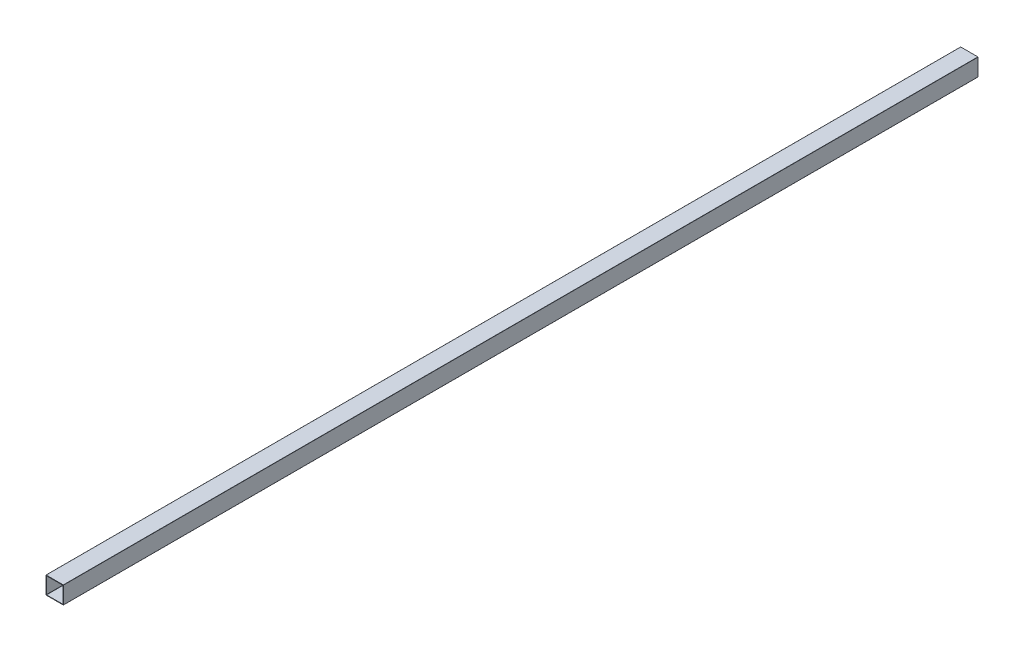
ISO-10303-21;
HEADER;
FILE_DESCRIPTION(('STEP AP214'),'2;1');
FILE_NAME('part.step','',(''),(''),'','','');
FILE_SCHEMA(('AUTOMOTIVE_DESIGN { 1 0 10303 214 1 1 1 1 }'));
ENDSEC;
DATA;
#1=APPLICATION_CONTEXT('core data for automotive mechanical design processes');
#2=APPLICATION_PROTOCOL_DEFINITION('international standard','automotive_design',2000,#1);
#3=PRODUCT_CONTEXT('',#1,'mechanical');
#4=PRODUCT('Part','Part','',(#3));
#5=PRODUCT_RELATED_PRODUCT_CATEGORY('part','',(#4));
#6=PRODUCT_DEFINITION_FORMATION('','',#4);
#7=PRODUCT_DEFINITION_CONTEXT('part definition',#1,'design');
#8=PRODUCT_DEFINITION('design','',#6,#7);
#9=PRODUCT_DEFINITION_SHAPE('','',#8);
#10=(LENGTH_UNIT() NAMED_UNIT(*) SI_UNIT(.MILLI.,.METRE.));
#11=(NAMED_UNIT(*) PLANE_ANGLE_UNIT() SI_UNIT($,.RADIAN.));
#12=(NAMED_UNIT(*) SI_UNIT($,.STERADIAN.) SOLID_ANGLE_UNIT());
#13=UNCERTAINTY_MEASURE_WITH_UNIT(LENGTH_MEASURE(1.E-05),#10,'distance_accuracy_value','');
#14=(GEOMETRIC_REPRESENTATION_CONTEXT(3) GLOBAL_UNCERTAINTY_ASSIGNED_CONTEXT((#13)) GLOBAL_UNIT_ASSIGNED_CONTEXT((#10,
#11,#12)) REPRESENTATION_CONTEXT('',''));
#15=CARTESIAN_POINT('',(0.,0.,0.));
#16=DIRECTION('',(0.,0.,1.));
#17=DIRECTION('',(1.,0.,0.));
#18=AXIS2_PLACEMENT_3D('',#15,#16,#17);
#19=CARTESIAN_POINT('',(57.15,-57.15,-6000.));
#20=DIRECTION('',(1.,0.,0.));
#21=DIRECTION('',(0.,0.,-1.));
#22=AXIS2_PLACEMENT_3D('',#19,#20,#21);
#23=PLANE('',#22);
#24=DIRECTION('',(0.,1.,0.));
#25=VECTOR('',#24,1.);
#26=CARTESIAN_POINT('',(57.15,-57.15,0.));
#27=LINE('',#26,#25);
#28=CARTESIAN_POINT('',(57.15,-56.15,0.));
#29=VERTEX_POINT('',#28);
#30=CARTESIAN_POINT('',(57.15,56.15,0.));
#31=VERTEX_POINT('',#30);
#32=EDGE_CURVE('E197',#29,#31,#27,.T.);
#33=ORIENTED_EDGE('',*,*,#32,.F.);
#34=DIRECTION('',(0.,0.,1.));
#35=VECTOR('',#34,1.);
#36=CARTESIAN_POINT('',(57.15,-56.15,-6000.));
#37=LINE('',#36,#35);
#38=CARTESIAN_POINT('',(57.15,-56.15,-6000.));
#39=VERTEX_POINT('',#38);
#40=EDGE_CURVE('E158',#29,#39,#37,.F.);
#41=ORIENTED_EDGE('',*,*,#40,.T.);
#42=DIRECTION('',(0.,1.,0.));
#43=VECTOR('',#42,1.);
#44=CARTESIAN_POINT('',(57.15,-57.15,-6000.));
#45=LINE('',#44,#43);
#46=CARTESIAN_POINT('',(57.15,56.15,-6000.));
#47=VERTEX_POINT('',#46);
#48=EDGE_CURVE('E185',#39,#47,#45,.T.);
#49=ORIENTED_EDGE('',*,*,#48,.T.);
#50=DIRECTION('',(0.,0.,1.));
#51=VECTOR('',#50,1.);
#52=CARTESIAN_POINT('',(57.15,56.15,-6000.));
#53=LINE('',#52,#51);
#54=EDGE_CURVE('E251',#47,#31,#53,.T.);
#55=ORIENTED_EDGE('',*,*,#54,.T.);
#56=EDGE_LOOP('',(#33,#41,#49,#55));
#57=FACE_BOUND('',#56,.T.);
#58=ADVANCED_FACE('F33',(#57),#23,.T.);
#59=CARTESIAN_POINT('',(-57.15,-57.15,-6000.));
#60=DIRECTION('',(0.,-1.,0.));
#61=DIRECTION('',(0.,0.,-1.));
#62=AXIS2_PLACEMENT_3D('',#59,#60,#61);
#63=PLANE('',#62);
#64=DIRECTION('',(1.,0.,0.));
#65=VECTOR('',#64,1.);
#66=CARTESIAN_POINT('',(-57.15,-57.15,0.));
#67=LINE('',#66,#65);
#68=CARTESIAN_POINT('',(-56.15,-57.15,0.));
#69=VERTEX_POINT('',#68);
#70=CARTESIAN_POINT('',(56.15,-57.15,0.));
#71=VERTEX_POINT('',#70);
#72=EDGE_CURVE('E189',#69,#71,#67,.T.);
#73=ORIENTED_EDGE('',*,*,#72,.F.);
#74=DIRECTION('',(0.,0.,1.));
#75=VECTOR('',#74,1.);
#76=CARTESIAN_POINT('',(-56.15,-57.15,-6000.));
#77=LINE('',#76,#75);
#78=CARTESIAN_POINT('',(-56.15,-57.15,-6000.));
#79=VERTEX_POINT('',#78);
#80=EDGE_CURVE('E238',#69,#79,#77,.F.);
#81=ORIENTED_EDGE('',*,*,#80,.T.);
#82=DIRECTION('',(1.,0.,0.));
#83=VECTOR('',#82,1.);
#84=CARTESIAN_POINT('',(-57.15,-57.15,-6000.));
#85=LINE('',#84,#83);
#86=CARTESIAN_POINT('',(56.15,-57.15,-6000.));
#87=VERTEX_POINT('',#86);
#88=EDGE_CURVE('E194',#79,#87,#85,.T.);
#89=ORIENTED_EDGE('',*,*,#88,.T.);
#90=DIRECTION('',(0.,0.,1.));
#91=VECTOR('',#90,1.);
#92=CARTESIAN_POINT('',(56.15,-57.15,-6000.));
#93=LINE('',#92,#91);
#94=EDGE_CURVE('E235',#87,#71,#93,.T.);
#95=ORIENTED_EDGE('',*,*,#94,.T.);
#96=EDGE_LOOP('',(#73,#81,#89,#95));
#97=FACE_BOUND('',#96,.T.);
#98=ADVANCED_FACE('F305',(#97),#63,.T.);
#99=CARTESIAN_POINT('',(-57.15,-57.15,-6000.));
#100=DIRECTION('',(-1.,0.,0.));
#101=DIRECTION('',(0.,0.,1.));
#102=AXIS2_PLACEMENT_3D('',#99,#100,#101);
#103=PLANE('',#102);
#104=DIRECTION('',(0.,-1.,0.));
#105=VECTOR('',#104,1.);
#106=CARTESIAN_POINT('',(-57.15,-57.15,-6000.));
#107=LINE('',#106,#105);
#108=CARTESIAN_POINT('',(-57.15,56.15,-6000.));
#109=VERTEX_POINT('',#108);
#110=CARTESIAN_POINT('',(-57.15,-56.15,-6000.));
#111=VERTEX_POINT('',#110);
#112=EDGE_CURVE('E191',#109,#111,#107,.T.);
#113=ORIENTED_EDGE('',*,*,#112,.T.);
#114=DIRECTION('',(0.,0.,1.));
#115=VECTOR('',#114,1.);
#116=CARTESIAN_POINT('',(-57.15,-56.15,-6000.));
#117=LINE('',#116,#115);
#118=CARTESIAN_POINT('',(-57.15,-56.15,0.));
#119=VERTEX_POINT('',#118);
#120=EDGE_CURVE('E224',#111,#119,#117,.T.);
#121=ORIENTED_EDGE('',*,*,#120,.T.);
#122=DIRECTION('',(0.,-1.,0.));
#123=VECTOR('',#122,1.);
#124=CARTESIAN_POINT('',(-57.15,-57.15,0.));
#125=LINE('',#124,#123);
#126=CARTESIAN_POINT('',(-57.15,56.15,0.));
#127=VERTEX_POINT('',#126);
#128=EDGE_CURVE('E203',#127,#119,#125,.T.);
#129=ORIENTED_EDGE('',*,*,#128,.F.);
#130=DIRECTION('',(0.,0.,1.));
#131=VECTOR('',#130,1.);
#132=CARTESIAN_POINT('',(-57.15,56.15,-6000.));
#133=LINE('',#132,#131);
#134=EDGE_CURVE('E222',#127,#109,#133,.F.);
#135=ORIENTED_EDGE('',*,*,#134,.T.);
#136=EDGE_LOOP('',(#113,#121,#129,#135));
#137=FACE_BOUND('',#136,.T.);
#138=ADVANCED_FACE('F311',(#137),#103,.T.);
#139=CARTESIAN_POINT('',(-57.15,57.15,-6000.));
#140=DIRECTION('',(0.,1.,0.));
#141=DIRECTION('',(0.,0.,1.));
#142=AXIS2_PLACEMENT_3D('',#139,#140,#141);
#143=PLANE('',#142);
#144=DIRECTION('',(-1.,0.,0.));
#145=VECTOR('',#144,1.);
#146=CARTESIAN_POINT('',(-57.15,57.15,-6000.));
#147=LINE('',#146,#145);
#148=CARTESIAN_POINT('',(56.15,57.15,-6000.));
#149=VERTEX_POINT('',#148);
#150=CARTESIAN_POINT('',(-56.15,57.15,-6000.));
#151=VERTEX_POINT('',#150);
#152=EDGE_CURVE('E188',#149,#151,#147,.T.);
#153=ORIENTED_EDGE('',*,*,#152,.T.);
#154=DIRECTION('',(0.,0.,1.));
#155=VECTOR('',#154,1.);
#156=CARTESIAN_POINT('',(-56.15,57.15,-6000.));
#157=LINE('',#156,#155);
#158=CARTESIAN_POINT('',(-56.15,57.15,0.));
#159=VERTEX_POINT('',#158);
#160=EDGE_CURVE('E248',#151,#159,#157,.T.);
#161=ORIENTED_EDGE('',*,*,#160,.T.);
#162=DIRECTION('',(-1.,0.,0.));
#163=VECTOR('',#162,1.);
#164=CARTESIAN_POINT('',(-57.15,57.15,0.));
#165=LINE('',#164,#163);
#166=CARTESIAN_POINT('',(56.15,57.15,0.));
#167=VERTEX_POINT('',#166);
#168=EDGE_CURVE('E200',#167,#159,#165,.T.);
#169=ORIENTED_EDGE('',*,*,#168,.F.);
#170=DIRECTION('',(0.,0.,1.));
#171=VECTOR('',#170,1.);
#172=CARTESIAN_POINT('',(56.15,57.15,-6000.));
#173=LINE('',#172,#171);
#174=EDGE_CURVE('E55',#167,#149,#173,.F.);
#175=ORIENTED_EDGE('',*,*,#174,.T.);
#176=EDGE_LOOP('',(#153,#161,#169,#175));
#177=FACE_BOUND('',#176,.T.);
#178=ADVANCED_FACE('F316',(#177),#143,.T.);
#179=CARTESIAN_POINT('',(0.,0.,-6000.));
#180=DIRECTION('',(0.,0.,-1.));
#181=DIRECTION('',(-1.,0.,0.));
#182=AXIS2_PLACEMENT_3D('',#179,#180,#181);
#183=PLANE('',#182);
#184=DIRECTION('',(0.,-1.,0.));
#185=VECTOR('',#184,1.);
#186=CARTESIAN_POINT('',(-54.11,-54.11,-6000.));
#187=LINE('',#186,#185);
#188=CARTESIAN_POINT('',(-54.11,53.11,-6000.));
#189=VERTEX_POINT('',#188);
#190=CARTESIAN_POINT('',(-54.11,-53.11,-6000.));
#191=VERTEX_POINT('',#190);
#192=EDGE_CURVE('E167',#189,#191,#187,.T.);
#193=ORIENTED_EDGE('',*,*,#192,.T.);
#194=CARTESIAN_POINT('',(-53.11,-53.11,-6000.));
#195=DIRECTION('',(0.,0.,-1.));
#196=DIRECTION('',(-1.,0.,0.));
#197=AXIS2_PLACEMENT_3D('',#194,#195,#196);
#198=CIRCLE('',#197,1.);
#199=CARTESIAN_POINT('',(-53.11,-54.11,-6000.));
#200=VERTEX_POINT('',#199);
#201=EDGE_CURVE('E11',#191,#200,#198,.F.);
#202=ORIENTED_EDGE('',*,*,#201,.T.);
#203=DIRECTION('',(1.,0.,0.));
#204=VECTOR('',#203,1.);
#205=CARTESIAN_POINT('',(-54.11,-54.11,-6000.));
#206=LINE('',#205,#204);
#207=CARTESIAN_POINT('',(53.11,-54.11,-6000.));
#208=VERTEX_POINT('',#207);
#209=EDGE_CURVE('E175',#200,#208,#206,.T.);
#210=ORIENTED_EDGE('',*,*,#209,.T.);
#211=CARTESIAN_POINT('',(53.11,-53.11,-6000.));
#212=DIRECTION('',(0.,0.,-1.));
#213=DIRECTION('',(-1.,0.,0.));
#214=AXIS2_PLACEMENT_3D('',#211,#212,#213);
#215=CIRCLE('',#214,1.);
#216=CARTESIAN_POINT('',(54.11,-53.11,-6000.));
#217=VERTEX_POINT('',#216);
#218=EDGE_CURVE('E262',#208,#217,#215,.F.);
#219=ORIENTED_EDGE('',*,*,#218,.T.);
#220=DIRECTION('',(0.,1.,0.));
#221=VECTOR('',#220,1.);
#222=CARTESIAN_POINT('',(54.11,-54.11,-6000.));
#223=LINE('',#222,#221);
#224=CARTESIAN_POINT('',(54.11,53.11,-6000.));
#225=VERTEX_POINT('',#224);
#226=EDGE_CURVE('E179',#217,#225,#223,.T.);
#227=ORIENTED_EDGE('',*,*,#226,.T.);
#228=CARTESIAN_POINT('',(53.11,53.11,-6000.));
#229=DIRECTION('',(0.,0.,-1.));
#230=DIRECTION('',(-1.,0.,0.));
#231=AXIS2_PLACEMENT_3D('',#228,#229,#230);
#232=CIRCLE('',#231,1.);
#233=CARTESIAN_POINT('',(53.11,54.11,-6000.));
#234=VERTEX_POINT('',#233);
#235=EDGE_CURVE('E258',#225,#234,#232,.F.);
#236=ORIENTED_EDGE('',*,*,#235,.T.);
#237=DIRECTION('',(-1.,0.,0.));
#238=VECTOR('',#237,1.);
#239=CARTESIAN_POINT('',(-54.11,54.11,-6000.));
#240=LINE('',#239,#238);
#241=CARTESIAN_POINT('',(-53.11,54.11,-6000.));
#242=VERTEX_POINT('',#241);
#243=EDGE_CURVE('E277',#234,#242,#240,.T.);
#244=ORIENTED_EDGE('',*,*,#243,.T.);
#245=CARTESIAN_POINT('',(-53.11,53.11,-6000.));
#246=DIRECTION('',(0.,0.,-1.));
#247=DIRECTION('',(-1.,0.,0.));
#248=AXIS2_PLACEMENT_3D('',#245,#246,#247);
#249=CIRCLE('',#248,1.);
#250=EDGE_CURVE('E157',#242,#189,#249,.F.);
#251=ORIENTED_EDGE('',*,*,#250,.T.);
#252=EDGE_LOOP('',(#193,#202,#210,#219,#227,#236,#244,#251));
#253=FACE_BOUND('',#252,.T.);
#254=ORIENTED_EDGE('',*,*,#88,.F.);
#255=CARTESIAN_POINT('',(-56.15,-56.15,-6000.));
#256=DIRECTION('',(0.,0.,-1.));
#257=DIRECTION('',(-1.,0.,0.));
#258=AXIS2_PLACEMENT_3D('',#255,#256,#257);
#259=CIRCLE('',#258,1.);
#260=EDGE_CURVE('E245',#79,#111,#259,.T.);
#261=ORIENTED_EDGE('',*,*,#260,.T.);
#262=ORIENTED_EDGE('',*,*,#112,.F.);
#263=CARTESIAN_POINT('',(-56.15,56.15,-6000.));
#264=DIRECTION('',(0.,0.,-1.));
#265=DIRECTION('',(-1.,0.,0.));
#266=AXIS2_PLACEMENT_3D('',#263,#264,#265);
#267=CIRCLE('',#266,1.);
#268=EDGE_CURVE('E48',#109,#151,#267,.T.);
#269=ORIENTED_EDGE('',*,*,#268,.T.);
#270=ORIENTED_EDGE('',*,*,#152,.F.);
#271=CARTESIAN_POINT('',(56.15,56.15,-6000.));
#272=DIRECTION('',(0.,0.,-1.));
#273=DIRECTION('',(-1.,0.,0.));
#274=AXIS2_PLACEMENT_3D('',#271,#272,#273);
#275=CIRCLE('',#274,1.);
#276=EDGE_CURVE('E240',#149,#47,#275,.T.);
#277=ORIENTED_EDGE('',*,*,#276,.T.);
#278=ORIENTED_EDGE('',*,*,#48,.F.);
#279=CARTESIAN_POINT('',(56.15,-56.15,-6000.));
#280=DIRECTION('',(0.,0.,-1.));
#281=DIRECTION('',(-1.,0.,0.));
#282=AXIS2_PLACEMENT_3D('',#279,#280,#281);
#283=CIRCLE('',#282,1.);
#284=EDGE_CURVE('E242',#39,#87,#283,.T.);
#285=ORIENTED_EDGE('',*,*,#284,.T.);
#286=EDGE_LOOP('',(#254,#261,#262,#269,#270,#277,#278,#285));
#287=FACE_BOUND('',#286,.T.);
#288=ADVANCED_FACE('F267',(#253,#287),#183,.T.);
#289=CARTESIAN_POINT('',(0.,0.,0.));
#290=DIRECTION('',(0.,0.,-1.));
#291=DIRECTION('',(-1.,0.,0.));
#292=AXIS2_PLACEMENT_3D('',#289,#290,#291);
#293=PLANE('',#292);
#294=DIRECTION('',(0.,1.,0.));
#295=VECTOR('',#294,1.);
#296=CARTESIAN_POINT('',(54.11,-54.11,0.));
#297=LINE('',#296,#295);
#298=CARTESIAN_POINT('',(54.11,-53.11,0.));
#299=VERTEX_POINT('',#298);
#300=CARTESIAN_POINT('',(54.11,53.11,0.));
#301=VERTEX_POINT('',#300);
#302=EDGE_CURVE('E181',#299,#301,#297,.T.);
#303=ORIENTED_EDGE('',*,*,#302,.F.);
#304=CARTESIAN_POINT('',(53.11,-53.11,0.));
#305=DIRECTION('',(0.,0.,-1.));
#306=DIRECTION('',(-1.,0.,0.));
#307=AXIS2_PLACEMENT_3D('',#304,#305,#306);
#308=CIRCLE('',#307,1.);
#309=CARTESIAN_POINT('',(53.11,-54.11,0.));
#310=VERTEX_POINT('',#309);
#311=EDGE_CURVE('E260',#299,#310,#308,.T.);
#312=ORIENTED_EDGE('',*,*,#311,.T.);
#313=DIRECTION('',(1.,0.,0.));
#314=VECTOR('',#313,1.);
#315=CARTESIAN_POINT('',(-54.11,-54.11,0.));
#316=LINE('',#315,#314);
#317=CARTESIAN_POINT('',(-53.11,-54.11,0.));
#318=VERTEX_POINT('',#317);
#319=EDGE_CURVE('E281',#318,#310,#316,.T.);
#320=ORIENTED_EDGE('',*,*,#319,.F.);
#321=CARTESIAN_POINT('',(-53.11,-53.11,0.));
#322=DIRECTION('',(0.,0.,-1.));
#323=DIRECTION('',(-1.,0.,0.));
#324=AXIS2_PLACEMENT_3D('',#321,#322,#323);
#325=CIRCLE('',#324,1.);
#326=CARTESIAN_POINT('',(-54.11,-53.11,0.));
#327=VERTEX_POINT('',#326);
#328=EDGE_CURVE('E41',#318,#327,#325,.T.);
#329=ORIENTED_EDGE('',*,*,#328,.T.);
#330=DIRECTION('',(0.,-1.,0.));
#331=VECTOR('',#330,1.);
#332=CARTESIAN_POINT('',(-54.11,-54.11,0.));
#333=LINE('',#332,#331);
#334=CARTESIAN_POINT('',(-54.11,53.11,0.));
#335=VERTEX_POINT('',#334);
#336=EDGE_CURVE('E164',#335,#327,#333,.T.);
#337=ORIENTED_EDGE('',*,*,#336,.F.);
#338=CARTESIAN_POINT('',(-53.11,53.11,0.));
#339=DIRECTION('',(0.,0.,-1.));
#340=DIRECTION('',(-1.,0.,0.));
#341=AXIS2_PLACEMENT_3D('',#338,#339,#340);
#342=CIRCLE('',#341,1.);
#343=CARTESIAN_POINT('',(-53.11,54.11,0.));
#344=VERTEX_POINT('',#343);
#345=EDGE_CURVE('E147',#335,#344,#342,.T.);
#346=ORIENTED_EDGE('',*,*,#345,.T.);
#347=DIRECTION('',(-1.,0.,0.));
#348=VECTOR('',#347,1.);
#349=CARTESIAN_POINT('',(-54.11,54.11,0.));
#350=LINE('',#349,#348);
#351=CARTESIAN_POINT('',(53.11,54.11,0.));
#352=VERTEX_POINT('',#351);
#353=EDGE_CURVE('E176',#352,#344,#350,.T.);
#354=ORIENTED_EDGE('',*,*,#353,.F.);
#355=CARTESIAN_POINT('',(53.11,53.11,0.));
#356=DIRECTION('',(0.,0.,-1.));
#357=DIRECTION('',(-1.,0.,0.));
#358=AXIS2_PLACEMENT_3D('',#355,#356,#357);
#359=CIRCLE('',#358,1.);
#360=EDGE_CURVE('E256',#352,#301,#359,.T.);
#361=ORIENTED_EDGE('',*,*,#360,.T.);
#362=EDGE_LOOP('',(#303,#312,#320,#329,#337,#346,#354,#361));
#363=FACE_BOUND('',#362,.T.);
#364=ORIENTED_EDGE('',*,*,#128,.T.);
#365=CARTESIAN_POINT('',(-56.15,-56.15,0.));
#366=DIRECTION('',(0.,0.,-1.));
#367=DIRECTION('',(-1.,0.,0.));
#368=AXIS2_PLACEMENT_3D('',#365,#366,#367);
#369=CIRCLE('',#368,1.);
#370=EDGE_CURVE('E233',#119,#69,#369,.F.);
#371=ORIENTED_EDGE('',*,*,#370,.T.);
#372=ORIENTED_EDGE('',*,*,#72,.T.);
#373=CARTESIAN_POINT('',(56.15,-56.15,0.));
#374=DIRECTION('',(0.,0.,-1.));
#375=DIRECTION('',(-1.,0.,0.));
#376=AXIS2_PLACEMENT_3D('',#373,#374,#375);
#377=CIRCLE('',#376,1.);
#378=EDGE_CURVE('E229',#71,#29,#377,.F.);
#379=ORIENTED_EDGE('',*,*,#378,.T.);
#380=ORIENTED_EDGE('',*,*,#32,.T.);
#381=CARTESIAN_POINT('',(56.15,56.15,0.));
#382=DIRECTION('',(0.,0.,-1.));
#383=DIRECTION('',(-1.,0.,0.));
#384=AXIS2_PLACEMENT_3D('',#381,#382,#383);
#385=CIRCLE('',#384,1.);
#386=EDGE_CURVE('E227',#31,#167,#385,.F.);
#387=ORIENTED_EDGE('',*,*,#386,.T.);
#388=ORIENTED_EDGE('',*,*,#168,.T.);
#389=CARTESIAN_POINT('',(-56.15,56.15,0.));
#390=DIRECTION('',(0.,0.,-1.));
#391=DIRECTION('',(-1.,0.,0.));
#392=AXIS2_PLACEMENT_3D('',#389,#390,#391);
#393=CIRCLE('',#392,1.);
#394=EDGE_CURVE('E231',#159,#127,#393,.F.);
#395=ORIENTED_EDGE('',*,*,#394,.T.);
#396=EDGE_LOOP('',(#364,#371,#372,#379,#380,#387,#388,#395));
#397=FACE_BOUND('',#396,.T.);
#398=ADVANCED_FACE('F172',(#363,#397),#293,.F.);
#399=CARTESIAN_POINT('',(-54.11,-54.11,-6000.));
#400=DIRECTION('',(0.,-1.,0.));
#401=DIRECTION('',(0.,0.,-1.));
#402=AXIS2_PLACEMENT_3D('',#399,#400,#401);
#403=PLANE('',#402);
#404=ORIENTED_EDGE('',*,*,#319,.T.);
#405=DIRECTION('',(0.,0.,1.));
#406=VECTOR('',#405,1.);
#407=CARTESIAN_POINT('',(53.11,-54.11,-6000.));
#408=LINE('',#407,#406);
#409=EDGE_CURVE('E220',#310,#208,#408,.F.);
#410=ORIENTED_EDGE('',*,*,#409,.T.);
#411=ORIENTED_EDGE('',*,*,#209,.F.);
#412=DIRECTION('',(0.,0.,1.));
#413=VECTOR('',#412,1.);
#414=CARTESIAN_POINT('',(-53.11,-54.11,0.));
#415=LINE('',#414,#413);
#416=EDGE_CURVE('E217',#200,#318,#415,.T.);
#417=ORIENTED_EDGE('',*,*,#416,.T.);
#418=EDGE_LOOP('',(#404,#410,#411,#417));
#419=FACE_BOUND('',#418,.T.);
#420=ADVANCED_FACE('F283',(#419),#403,.F.);
#421=CARTESIAN_POINT('',(-54.11,-54.11,-6000.));
#422=DIRECTION('',(-1.,0.,0.));
#423=DIRECTION('',(0.,0.,1.));
#424=AXIS2_PLACEMENT_3D('',#421,#422,#423);
#425=PLANE('',#424);
#426=ORIENTED_EDGE('',*,*,#192,.F.);
#427=DIRECTION('',(0.,0.,1.));
#428=VECTOR('',#427,1.);
#429=CARTESIAN_POINT('',(-54.11,53.11,0.));
#430=LINE('',#429,#428);
#431=EDGE_CURVE('E151',#189,#335,#430,.T.);
#432=ORIENTED_EDGE('',*,*,#431,.T.);
#433=ORIENTED_EDGE('',*,*,#336,.T.);
#434=DIRECTION('',(0.,0.,1.));
#435=VECTOR('',#434,1.);
#436=CARTESIAN_POINT('',(-54.11,-53.11,-6000.));
#437=LINE('',#436,#435);
#438=EDGE_CURVE('E169',#327,#191,#437,.F.);
#439=ORIENTED_EDGE('',*,*,#438,.T.);
#440=EDGE_LOOP('',(#426,#432,#433,#439));
#441=FACE_BOUND('',#440,.T.);
#442=ADVANCED_FACE('F163',(#441),#425,.F.);
#443=CARTESIAN_POINT('',(-54.11,54.11,-6000.));
#444=DIRECTION('',(0.,1.,0.));
#445=DIRECTION('',(0.,0.,1.));
#446=AXIS2_PLACEMENT_3D('',#443,#444,#445);
#447=PLANE('',#446);
#448=ORIENTED_EDGE('',*,*,#353,.T.);
#449=DIRECTION('',(0.,0.,1.));
#450=VECTOR('',#449,1.);
#451=CARTESIAN_POINT('',(-53.11,54.11,-6000.));
#452=LINE('',#451,#450);
#453=EDGE_CURVE('E152',#344,#242,#452,.F.);
#454=ORIENTED_EDGE('',*,*,#453,.T.);
#455=ORIENTED_EDGE('',*,*,#243,.F.);
#456=DIRECTION('',(0.,0.,1.));
#457=VECTOR('',#456,1.);
#458=CARTESIAN_POINT('',(53.11,54.11,0.));
#459=LINE('',#458,#457);
#460=EDGE_CURVE('E168',#234,#352,#459,.T.);
#461=ORIENTED_EDGE('',*,*,#460,.T.);
#462=EDGE_LOOP('',(#448,#454,#455,#461));
#463=FACE_BOUND('',#462,.T.);
#464=ADVANCED_FACE('F292',(#463),#447,.F.);
#465=CARTESIAN_POINT('',(54.11,-54.11,-6000.));
#466=DIRECTION('',(1.,0.,0.));
#467=DIRECTION('',(0.,1.,0.));
#468=AXIS2_PLACEMENT_3D('',#465,#466,#467);
#469=PLANE('',#468);
#470=ORIENTED_EDGE('',*,*,#302,.T.);
#471=DIRECTION('',(0.,0.,1.));
#472=VECTOR('',#471,1.);
#473=CARTESIAN_POINT('',(54.11,53.11,-6000.));
#474=LINE('',#473,#472);
#475=EDGE_CURVE('E215',#301,#225,#474,.F.);
#476=ORIENTED_EDGE('',*,*,#475,.T.);
#477=ORIENTED_EDGE('',*,*,#226,.F.);
#478=DIRECTION('',(0.,0.,1.));
#479=VECTOR('',#478,1.);
#480=CARTESIAN_POINT('',(54.11,-53.11,0.));
#481=LINE('',#480,#479);
#482=EDGE_CURVE('E212',#217,#299,#481,.T.);
#483=ORIENTED_EDGE('',*,*,#482,.T.);
#484=EDGE_LOOP('',(#470,#476,#477,#483));
#485=FACE_BOUND('',#484,.T.);
#486=ADVANCED_FACE('F275',(#485),#469,.F.);
#487=CARTESIAN_POINT('',(-53.11,53.11,-6000.));
#488=DIRECTION('',(0.,0.,-1.));
#489=DIRECTION('',(-1.,0.,0.));
#490=AXIS2_PLACEMENT_3D('',#487,#488,#489);
#491=CYLINDRICAL_SURFACE('',#490,1.);
#492=ORIENTED_EDGE('',*,*,#250,.F.);
#493=ORIENTED_EDGE('',*,*,#453,.F.);
#494=ORIENTED_EDGE('',*,*,#345,.F.);
#495=ORIENTED_EDGE('',*,*,#431,.F.);
#496=EDGE_LOOP('',(#492,#493,#494,#495));
#497=FACE_BOUND('',#496,.T.);
#498=ADVANCED_FACE('F150',(#497),#491,.F.);
#499=CARTESIAN_POINT('',(53.11,53.11,-6000.));
#500=DIRECTION('',(0.,0.,-1.));
#501=DIRECTION('',(-1.,0.,0.));
#502=AXIS2_PLACEMENT_3D('',#499,#500,#501);
#503=CYLINDRICAL_SURFACE('',#502,1.);
#504=ORIENTED_EDGE('',*,*,#235,.F.);
#505=ORIENTED_EDGE('',*,*,#475,.F.);
#506=ORIENTED_EDGE('',*,*,#360,.F.);
#507=ORIENTED_EDGE('',*,*,#460,.F.);
#508=EDGE_LOOP('',(#504,#505,#506,#507));
#509=FACE_BOUND('',#508,.T.);
#510=ADVANCED_FACE('F294',(#509),#503,.F.);
#511=CARTESIAN_POINT('',(53.11,-53.11,-6000.));
#512=DIRECTION('',(0.,0.,-1.));
#513=DIRECTION('',(-1.,0.,0.));
#514=AXIS2_PLACEMENT_3D('',#511,#512,#513);
#515=CYLINDRICAL_SURFACE('',#514,1.);
#516=ORIENTED_EDGE('',*,*,#218,.F.);
#517=ORIENTED_EDGE('',*,*,#409,.F.);
#518=ORIENTED_EDGE('',*,*,#311,.F.);
#519=ORIENTED_EDGE('',*,*,#482,.F.);
#520=EDGE_LOOP('',(#516,#517,#518,#519));
#521=FACE_BOUND('',#520,.T.);
#522=ADVANCED_FACE('F279',(#521),#515,.F.);
#523=CARTESIAN_POINT('',(-56.15,-56.15,-6000.));
#524=DIRECTION('',(0.,0.,1.));
#525=DIRECTION('',(1.,0.,0.));
#526=AXIS2_PLACEMENT_3D('',#523,#524,#525);
#527=CYLINDRICAL_SURFACE('',#526,1.);
#528=ORIENTED_EDGE('',*,*,#260,.F.);
#529=ORIENTED_EDGE('',*,*,#80,.F.);
#530=ORIENTED_EDGE('',*,*,#370,.F.);
#531=ORIENTED_EDGE('',*,*,#120,.F.);
#532=EDGE_LOOP('',(#528,#529,#530,#531));
#533=FACE_BOUND('',#532,.T.);
#534=ADVANCED_FACE('F301',(#533),#527,.T.);
#535=CARTESIAN_POINT('',(-56.15,56.15,-6000.));
#536=DIRECTION('',(0.,0.,1.));
#537=DIRECTION('',(1.,0.,0.));
#538=AXIS2_PLACEMENT_3D('',#535,#536,#537);
#539=CYLINDRICAL_SURFACE('',#538,1.);
#540=ORIENTED_EDGE('',*,*,#268,.F.);
#541=ORIENTED_EDGE('',*,*,#134,.F.);
#542=ORIENTED_EDGE('',*,*,#394,.F.);
#543=ORIENTED_EDGE('',*,*,#160,.F.);
#544=EDGE_LOOP('',(#540,#541,#542,#543));
#545=FACE_BOUND('',#544,.T.);
#546=ADVANCED_FACE('F368',(#545),#539,.T.);
#547=CARTESIAN_POINT('',(-53.11,-53.11,-6000.));
#548=DIRECTION('',(0.,0.,-1.));
#549=DIRECTION('',(-1.,0.,0.));
#550=AXIS2_PLACEMENT_3D('',#547,#548,#549);
#551=CYLINDRICAL_SURFACE('',#550,1.);
#552=ORIENTED_EDGE('',*,*,#201,.F.);
#553=ORIENTED_EDGE('',*,*,#438,.F.);
#554=ORIENTED_EDGE('',*,*,#328,.F.);
#555=ORIENTED_EDGE('',*,*,#416,.F.);
#556=EDGE_LOOP('',(#552,#553,#554,#555));
#557=FACE_BOUND('',#556,.T.);
#558=ADVANCED_FACE('F378',(#557),#551,.F.);
#559=CARTESIAN_POINT('',(56.15,-56.15,-6000.));
#560=DIRECTION('',(0.,0.,1.));
#561=DIRECTION('',(1.,0.,0.));
#562=AXIS2_PLACEMENT_3D('',#559,#560,#561);
#563=CYLINDRICAL_SURFACE('',#562,1.);
#564=ORIENTED_EDGE('',*,*,#284,.F.);
#565=ORIENTED_EDGE('',*,*,#40,.F.);
#566=ORIENTED_EDGE('',*,*,#378,.F.);
#567=ORIENTED_EDGE('',*,*,#94,.F.);
#568=EDGE_LOOP('',(#564,#565,#566,#567));
#569=FACE_BOUND('',#568,.T.);
#570=ADVANCED_FACE('F388',(#569),#563,.T.);
#571=CARTESIAN_POINT('',(56.15,56.15,-6000.));
#572=DIRECTION('',(0.,0.,1.));
#573=DIRECTION('',(1.,0.,0.));
#574=AXIS2_PLACEMENT_3D('',#571,#572,#573);
#575=CYLINDRICAL_SURFACE('',#574,1.);
#576=ORIENTED_EDGE('',*,*,#276,.F.);
#577=ORIENTED_EDGE('',*,*,#174,.F.);
#578=ORIENTED_EDGE('',*,*,#386,.F.);
#579=ORIENTED_EDGE('',*,*,#54,.F.);
#580=EDGE_LOOP('',(#576,#577,#578,#579));
#581=FACE_BOUND('',#580,.T.);
#582=ADVANCED_FACE('F35',(#581),#575,.T.);
#583=CLOSED_SHELL('',(#58,#98,#138,#178,#288,#398,#420,#442,#464,#486,#498,#510,#522,#534,#546,
#558,#570,#582));
#584=MANIFOLD_SOLID_BREP('B2',#583);
#585=ADVANCED_BREP_SHAPE_REPRESENTATION('',(#18,#584),#14);
#586=SHAPE_DEFINITION_REPRESENTATION(#9,#585);
ENDSEC;
END-ISO-10303-21;
